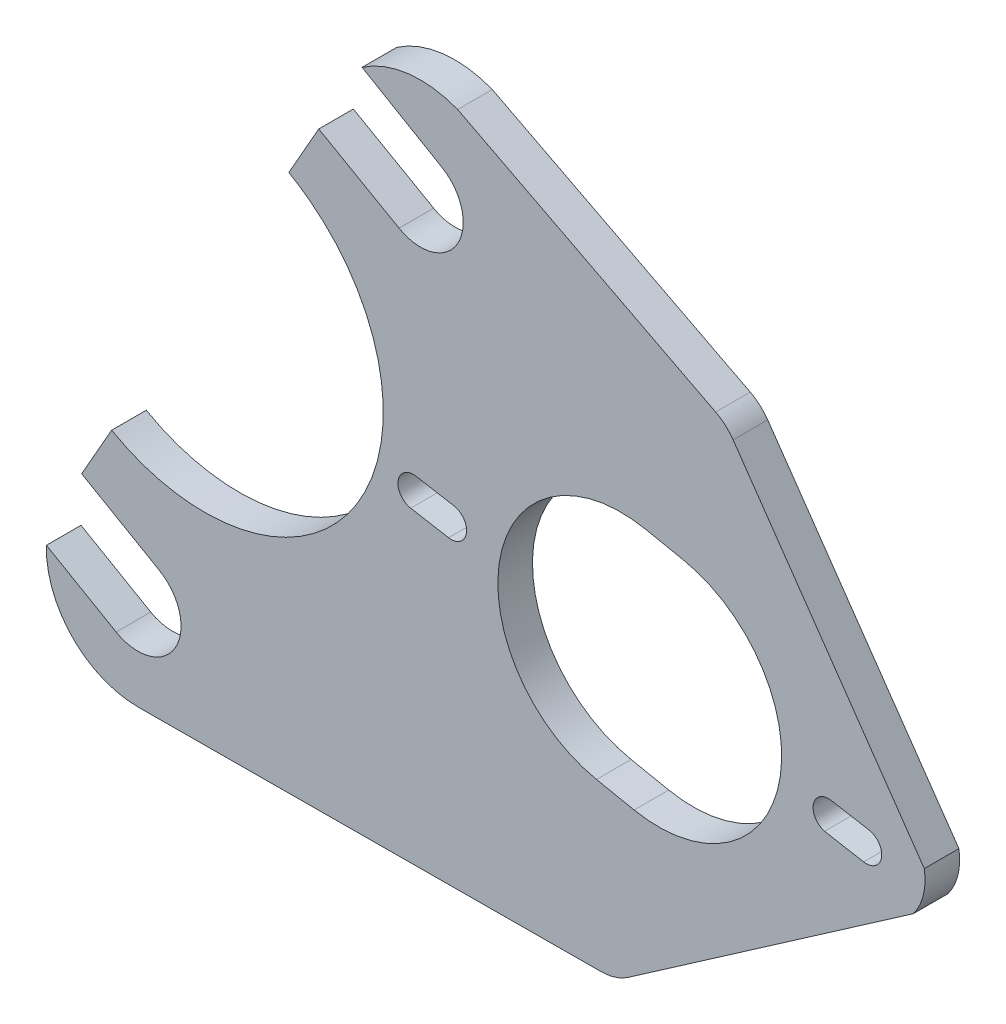
ISO-10303-21;
HEADER;
FILE_DESCRIPTION(('STEP AP214'),'2;1');
FILE_NAME('part.step','',(''),(''),'','','');
FILE_SCHEMA(('AUTOMOTIVE_DESIGN { 1 0 10303 214 1 1 1 1 }'));
ENDSEC;
DATA;
#1=APPLICATION_CONTEXT('core data for automotive mechanical design processes');
#2=APPLICATION_PROTOCOL_DEFINITION('international standard','automotive_design',2000,#1);
#3=PRODUCT_CONTEXT('',#1,'mechanical');
#4=PRODUCT('Part','Part','',(#3));
#5=PRODUCT_RELATED_PRODUCT_CATEGORY('part','',(#4));
#6=PRODUCT_DEFINITION_FORMATION('','',#4);
#7=PRODUCT_DEFINITION_CONTEXT('part definition',#1,'design');
#8=PRODUCT_DEFINITION('design','',#6,#7);
#9=PRODUCT_DEFINITION_SHAPE('','',#8);
#10=(LENGTH_UNIT() NAMED_UNIT(*) SI_UNIT(.MILLI.,.METRE.));
#11=(NAMED_UNIT(*) PLANE_ANGLE_UNIT() SI_UNIT($,.RADIAN.));
#12=(NAMED_UNIT(*) SI_UNIT($,.STERADIAN.) SOLID_ANGLE_UNIT());
#13=UNCERTAINTY_MEASURE_WITH_UNIT(LENGTH_MEASURE(1.E-05),#10,'distance_accuracy_value','');
#14=(GEOMETRIC_REPRESENTATION_CONTEXT(3) GLOBAL_UNCERTAINTY_ASSIGNED_CONTEXT((#13)) GLOBAL_UNIT_ASSIGNED_CONTEXT((#10,
#11,#12)) REPRESENTATION_CONTEXT('',''));
#15=CARTESIAN_POINT('',(0.,0.,0.));
#16=DIRECTION('',(0.,0.,1.));
#17=DIRECTION('',(1.,0.,0.));
#18=AXIS2_PLACEMENT_3D('',#15,#16,#17);
#19=CARTESIAN_POINT('',(66.2260905389,75.3633362444,3.6));
#20=DIRECTION('',(0.,0.,1.));
#21=DIRECTION('',(1.,0.,0.));
#22=AXIS2_PLACEMENT_3D('',#19,#20,#21);
#23=PLANE('',#22);
#24=CARTESIAN_POINT('',(88.3938452046275,69.2605225420493,3.6));
#25=DIRECTION('',(0.,0.,1.));
#26=DIRECTION('',(1.,0.,0.));
#27=AXIS2_PLACEMENT_3D('',#24,#25,#26);
#28=CIRCLE('',#27,1.59999999999999);
#29=CARTESIAN_POINT('',(88.6716822936606,70.8362149460285,3.6));
#30=VERTEX_POINT('',#29);
#31=CARTESIAN_POINT('',(88.1160081155943,67.6848301380701,3.6));
#32=VERTEX_POINT('',#31);
#33=EDGE_CURVE('E451',#30,#32,#28,.T.);
#34=ORIENTED_EDGE('',*,*,#33,.F.);
#35=DIRECTION('',(-0.984807752486968,0.173648180645713,0.));
#36=VECTOR('',#35,1.);
#37=CARTESIAN_POINT('',(14.7874848721338,83.8639926298628,3.6));
#38=LINE('',#37,#36);
#39=CARTESIAN_POINT('',(92.6109133036085,70.1416222234456,3.6));
#40=VERTEX_POINT('',#39);
#41=EDGE_CURVE('E449',#40,#30,#38,.T.);
#42=ORIENTED_EDGE('',*,*,#41,.F.);
#43=CARTESIAN_POINT('',(92.3330762145753,68.5659298194664,3.6));
#44=DIRECTION('',(0.,0.,1.));
#45=DIRECTION('',(1.,0.,0.));
#46=AXIS2_PLACEMENT_3D('',#43,#44,#45);
#47=CIRCLE('',#46,1.6);
#48=CARTESIAN_POINT('',(92.0552391303082,66.9902374146469,3.6));
#49=VERTEX_POINT('',#48);
#50=EDGE_CURVE('E457',#49,#40,#47,.T.);
#51=ORIENTED_EDGE('',*,*,#50,.F.);
#52=DIRECTION('',(-0.984807752486969,0.173648180645707,0.));
#53=VECTOR('',#52,1.);
#54=CARTESIAN_POINT('',(14.231810694067,80.7126078219041,3.6));
#55=LINE('',#54,#53);
#56=EDGE_CURVE('E454',#49,#32,#55,.T.);
#57=ORIENTED_EDGE('',*,*,#56,.T.);
#58=EDGE_LOOP('',(#34,#42,#51,#57));
#59=FACE_BOUND('',#58,.T.);
#60=DIRECTION('',(-0.98457738784415,0.174949613734897,0.));
#61=VECTOR('',#60,1.);
#62=CARTESIAN_POINT('',(14.3668853296237,80.8536248084082,3.6));
#63=LINE('',#62,#61);
#64=CARTESIAN_POINT('',(135.228884267393,59.377649135547,3.6));
#65=VERTEX_POINT('',#64);
#66=CARTESIAN_POINT('',(131.161569827429,60.1003704766984,3.6));
#67=VERTEX_POINT('',#66);
#68=EDGE_CURVE('E480',#65,#67,#63,.T.);
#69=ORIENTED_EDGE('',*,*,#68,.T.);
#70=CARTESIAN_POINT('',(131.569557431556,61.6474794304822,3.6));
#71=DIRECTION('',(0.,0.,1.));
#72=DIRECTION('',(1.,0.,0.));
#73=AXIS2_PLACEMENT_3D('',#70,#71,#72);
#74=CIRCLE('',#73,1.6);
#75=CARTESIAN_POINT('',(131.847360571655,63.2231778201976,3.6));
#76=VERTEX_POINT('',#75);
#77=EDGE_CURVE('E489',#76,#67,#74,.T.);
#78=ORIENTED_EDGE('',*,*,#77,.F.);
#79=DIRECTION('',(-0.98481149357211,0.173626962561322,0.));
#80=VECTOR('',#79,1.);
#81=CARTESIAN_POINT('',(14.7852333251543,83.86178908483,3.6));
#82=LINE('',#81,#80);
#83=CARTESIAN_POINT('',(135.786606545943,62.5286699699523,3.6));
#84=VERTEX_POINT('',#83);
#85=EDGE_CURVE('E486',#84,#76,#82,.T.);
#86=ORIENTED_EDGE('',*,*,#85,.F.);
#87=CARTESIAN_POINT('',(135.508803527145,60.952972268249,3.6));
#88=DIRECTION('',(0.,0.,1.));
#89=DIRECTION('',(1.,0.,0.));
#90=AXIS2_PLACEMENT_3D('',#87,#88,#89);
#91=CIRCLE('',#90,1.59999930137684);
#92=EDGE_CURVE('E483',#65,#84,#91,.T.);
#93=ORIENTED_EDGE('',*,*,#92,.F.);
#94=EDGE_LOOP('',(#69,#78,#86,#93));
#95=FACE_BOUND('',#94,.T.);
#96=CARTESIAN_POINT('',(109.981701342205,65.4540011230173,3.6));
#97=DIRECTION('',(0.,0.,1.));
#98=DIRECTION('',(1.,0.,0.));
#99=AXIS2_PLACEMENT_3D('',#96,#97,#98);
#100=CIRCLE('',#99,12.8);
#101=CARTESIAN_POINT('',(112.523140625589,77.9991629939887,3.6));
#102=VERTEX_POINT('',#101);
#103=CARTESIAN_POINT('',(107.440262058821,52.908839252046,3.6));
#104=VERTEX_POINT('',#103);
#105=EDGE_CURVE('E512',#102,#104,#100,.T.);
#106=ORIENTED_EDGE('',*,*,#105,.F.);
#107=DIRECTION('',(-0.980090771169636,0.198549944014369,0.));
#108=VECTOR('',#107,1.);
#109=CARTESIAN_POINT('',(19.6142968870189,96.8209356964479,3.6));
#110=LINE('',#109,#108);
#111=CARTESIAN_POINT('',(116.443503710267,77.2049632179312,3.6));
#112=VERTEX_POINT('',#111);
#113=EDGE_CURVE('E510',#112,#102,#110,.T.);
#114=ORIENTED_EDGE('',*,*,#113,.F.);
#115=CARTESIAN_POINT('',(113.902064426883,64.6598013469599,3.6));
#116=DIRECTION('',(0.,0.,1.));
#117=DIRECTION('',(1.,0.,0.));
#118=AXIS2_PLACEMENT_3D('',#115,#116,#117);
#119=CIRCLE('',#118,12.8);
#120=CARTESIAN_POINT('',(111.3606251435,52.1146394759885,3.6));
#121=VERTEX_POINT('',#120);
#122=EDGE_CURVE('E518',#121,#112,#119,.T.);
#123=ORIENTED_EDGE('',*,*,#122,.F.);
#124=DIRECTION('',(-0.980090771169636,0.198549944014369,0.));
#125=VECTOR('',#124,1.);
#126=CARTESIAN_POINT('',(14.5314183202511,71.7306119545052,3.6));
#127=LINE('',#126,#125);
#128=EDGE_CURVE('E515',#121,#104,#127,.T.);
#129=ORIENTED_EDGE('',*,*,#128,.T.);
#130=EDGE_LOOP('',(#106,#114,#123,#129));
#131=FACE_BOUND('',#130,.T.);
#132=DIRECTION('',(-0.821795837048083,-0.569782065539484,0.));
#133=VECTOR('',#132,1.);
#134=CARTESIAN_POINT('',(98.7671263425765,28.429448054406,3.6));
#135=LINE('',#134,#133);
#136=CARTESIAN_POINT('',(140.392023866923,57.2895602867628,3.6));
#137=VERTEX_POINT('',#136);
#138=CARTESIAN_POINT('',(110.735316218971,36.7274457335327,3.6));
#139=VERTEX_POINT('',#138);
#140=EDGE_CURVE('E440',#137,#139,#135,.T.);
#141=ORIENTED_EDGE('',*,*,#140,.F.);
#142=CARTESIAN_POINT('',(135.508803527145,60.952972268249,3.6));
#143=DIRECTION('',(0.,0.,1.));
#144=DIRECTION('',(1.,0.,0.));
#145=AXIS2_PLACEMENT_3D('',#142,#143,#144);
#146=CIRCLE('',#145,6.10462351279076);
#147=CARTESIAN_POINT('',(141.535727347608,61.9238571714403,3.6));
#148=VERTEX_POINT('',#147);
#149=EDGE_CURVE('E422',#137,#148,#146,.T.);
#150=ORIENTED_EDGE('',*,*,#149,.T.);
#151=DIRECTION('',(0.569782065539484,-0.821795837048083,0.));
#152=VECTOR('',#151,1.);
#153=CARTESIAN_POINT('',(124.581434059325,86.3770095029575,3.6));
#154=LINE('',#153,#152);
#155=CARTESIAN_POINT('',(121.651882961464,90.6022967526749,3.6));
#156=VERTEX_POINT('',#155);
#157=EDGE_CURVE('E426',#156,#148,#154,.T.);
#158=ORIENTED_EDGE('',*,*,#157,.F.);
#159=CARTESIAN_POINT('',(117.542903776224,87.7533864249775,3.6));
#160=DIRECTION('',(0.,0.,1.));
#161=DIRECTION('',(1.,0.,0.));
#162=AXIS2_PLACEMENT_3D('',#159,#160,#161);
#163=CIRCLE('',#162,5.);
#164=CARTESIAN_POINT('',(119.834613545866,92.1972660736322,3.6));
#165=VERTEX_POINT('',#164);
#166=EDGE_CURVE('E711',#156,#165,#163,.T.);
#167=ORIENTED_EDGE('',*,*,#166,.T.);
#168=DIRECTION('',(-0.888775929730931,0.458341953928417,0.));
#169=VECTOR('',#168,1.);
#170=CARTESIAN_POINT('',(62.7323198720739,121.64493221842,3.6));
#171=LINE('',#170,#169);
#172=CARTESIAN_POINT('',(92.9994998125568,106.0361404749,3.6));
#173=VERTEX_POINT('',#172);
#174=EDGE_CURVE('E447',#165,#173,#171,.T.);
#175=ORIENTED_EDGE('',*,*,#174,.T.);
#176=CARTESIAN_POINT('',(89.1295998537948,96.1540237001324,3.6));
#177=DIRECTION('',(0.,0.,1.));
#178=DIRECTION('',(1.,0.,0.));
#179=AXIS2_PLACEMENT_3D('',#176,#177,#178);
#180=CIRCLE('',#179,10.6128392827256);
#181=CARTESIAN_POINT('',(83.0608323656568,104.8604821544,3.6));
#182=VERTEX_POINT('',#181);
#183=EDGE_CURVE('E696',#173,#182,#180,.T.);
#184=ORIENTED_EDGE('',*,*,#183,.T.);
#185=DIRECTION('',(0.863225442370652,-0.504818616578263,0.));
#186=VECTOR('',#185,1.);
#187=CARTESIAN_POINT('',(83.0608323656568,104.8604821544,3.6));
#188=LINE('',#187,#186);
#189=CARTESIAN_POINT('',(91.3561306915568,100.0093496235,3.6));
#190=VERTEX_POINT('',#189);
#191=EDGE_CURVE('E723',#182,#190,#188,.T.);
#192=ORIENTED_EDGE('',*,*,#191,.T.);
#193=CARTESIAN_POINT('',(89.1300439095068,96.1537673169998,3.6));
#194=DIRECTION('',(0.,0.,1.));
#195=DIRECTION('',(1.,0.,0.));
#196=AXIS2_PLACEMENT_3D('',#193,#194,#195);
#197=CIRCLE('',#196,4.45207561519496);
#198=CARTESIAN_POINT('',(86.9039571274568,92.2981850104998,3.6));
#199=VERTEX_POINT('',#198);
#200=EDGE_CURVE('E725',#199,#190,#197,.T.);
#201=ORIENTED_EDGE('',*,*,#200,.F.);
#202=DIRECTION('',(0.868810396856309,-0.495144922537214,0.));
#203=VECTOR('',#202,1.);
#204=CARTESIAN_POINT('',(78.5551802845568,97.0562478491998,3.6));
#205=LINE('',#204,#203);
#206=CARTESIAN_POINT('',(78.5551802845568,97.0562478491998,3.6));
#207=VERTEX_POINT('',#206);
#208=EDGE_CURVE('E748',#207,#199,#205,.T.);
#209=ORIENTED_EDGE('',*,*,#208,.F.);
#210=DIRECTION('',(0.494117617130238,0.869395065802386,0.));
#211=VECTOR('',#210,1.);
#212=CARTESIAN_POINT('',(75.4400477996607,91.5752030173668,3.6));
#213=LINE('',#212,#211);
#214=CARTESIAN_POINT('',(75.4400477996607,91.5752030173668,3.6));
#215=VERTEX_POINT('',#214);
#216=EDGE_CURVE('E564',#215,#207,#213,.T.);
#217=ORIENTED_EDGE('',*,*,#216,.F.);
#218=CARTESIAN_POINT('',(66.2260905389,75.3633362444,3.6));
#219=DIRECTION('',(0.,0.,1.));
#220=DIRECTION('',(0.869395065803295,-0.494117617128639,0.));
#221=AXIS2_PLACEMENT_3D('',#218,#219,#220);
#222=ELLIPSE('',#221,19.1691381710503,18.6472955858899);
#223=CARTESIAN_POINT('',(57.0121332781069,59.1514694714516,3.6));
#224=VERTEX_POINT('',#223);
#225=EDGE_CURVE('E560',#224,#215,#222,.T.);
#226=ORIENTED_EDGE('',*,*,#225,.F.);
#227=DIRECTION('',(0.494117617130272,0.869395065802367,0.));
#228=VECTOR('',#227,1.);
#229=CARTESIAN_POINT('',(53.8970007932,53.6704246396,3.6));
#230=LINE('',#229,#228);
#231=CARTESIAN_POINT('',(53.8970007932,53.6704246396,3.6));
#232=VERTEX_POINT('',#231);
#233=EDGE_CURVE('E557',#232,#224,#230,.T.);
#234=ORIENTED_EDGE('',*,*,#233,.F.);
#235=DIRECTION('',(-0.865993027095381,0.500056073877899,0.));
#236=VECTOR('',#235,1.);
#237=CARTESIAN_POINT('',(61.9848103957,49.0002273175,3.6));
#238=LINE('',#237,#236);
#239=CARTESIAN_POINT('',(61.9848103957,49.0002273175,3.6));
#240=VERTEX_POINT('',#239);
#241=EDGE_CURVE('E554',#240,#232,#238,.T.);
#242=ORIENTED_EDGE('',*,*,#241,.F.);
#243=CARTESIAN_POINT('',(59.73290559445,45.10432597855,3.6));
#244=DIRECTION('',(0.,0.,1.));
#245=DIRECTION('',(1.,0.,0.));
#246=AXIS2_PLACEMENT_3D('',#243,#244,#245);
#247=CIRCLE('',#246,4.49990249635758);
#248=CARTESIAN_POINT('',(57.4810007932,41.2084246396,3.6));
#249=VERTEX_POINT('',#248);
#250=EDGE_CURVE('E551',#249,#240,#247,.T.);
#251=ORIENTED_EDGE('',*,*,#250,.F.);
#252=DIRECTION('',(0.866028909405279,-0.499993928037435,0.));
#253=VECTOR('',#252,1.);
#254=CARTESIAN_POINT('',(50.2285358717,45.3955694158,3.6));
#255=LINE('',#254,#253);
#256=CARTESIAN_POINT('',(50.2285358717,45.3955694158,3.6));
#257=VERTEX_POINT('',#256);
#258=EDGE_CURVE('E548',#257,#249,#255,.T.);
#259=ORIENTED_EDGE('',*,*,#258,.F.);
#260=CARTESIAN_POINT('',(59.7347823866165,45.103647176955,3.6));
#261=DIRECTION('',(0.,0.,1.));
#262=DIRECTION('',(1.,0.,0.));
#263=AXIS2_PLACEMENT_3D('',#260,#261,#262);
#264=CIRCLE('',#263,9.51072770064907);
#265=CARTESIAN_POINT('',(59.7828894487,35.5930411444,3.6));
#266=VERTEX_POINT('',#265);
#267=EDGE_CURVE('E544',#257,#266,#264,.T.);
#268=ORIENTED_EDGE('',*,*,#267,.T.);
#269=DIRECTION('',(0.999987207278143,0.00505818940525294,0.));
#270=VECTOR('',#269,1.);
#271=CARTESIAN_POINT('',(107.879099237603,35.8363239954365,3.6));
#272=LINE('',#271,#270);
#273=CARTESIAN_POINT('',(107.9116968383,35.8364888823843,3.6));
#274=VERTEX_POINT('',#273);
#275=EDGE_CURVE('E541',#266,#274,#272,.T.);
#276=ORIENTED_EDGE('',*,*,#275,.T.);
#277=CARTESIAN_POINT('',(107.886405891274,40.8364249187731,3.6));
#278=DIRECTION('',(0.,0.,1.));
#279=DIRECTION('',(1.,0.,0.));
#280=AXIS2_PLACEMENT_3D('',#277,#278,#279);
#281=CIRCLE('',#280,5.);
#282=EDGE_CURVE('E761',#274,#139,#281,.T.);
#283=ORIENTED_EDGE('',*,*,#282,.T.);
#284=EDGE_LOOP('',(#141,#150,#158,#167,#175,#184,#192,#201,#209,#217,#226,#234,#242,#251,#259,
#268,#276,#283));
#285=FACE_BOUND('',#284,.T.);
#286=ADVANCED_FACE('F224',(#59,#95,#131,#285),#23,.T.);
#287=CARTESIAN_POINT('',(66.2260905389,75.3633362444,0.));
#288=DIRECTION('',(0.,0.,1.));
#289=DIRECTION('',(1.,0.,0.));
#290=AXIS2_PLACEMENT_3D('',#287,#288,#289);
#291=PLANE('',#290);
#292=DIRECTION('',(-0.984807752486968,0.173648180645713,0.));
#293=VECTOR('',#292,1.);
#294=CARTESIAN_POINT('',(14.7874848721338,83.8639926298628,0.));
#295=LINE('',#294,#293);
#296=CARTESIAN_POINT('',(92.6109133036085,70.1416222234456,0.));
#297=VERTEX_POINT('',#296);
#298=CARTESIAN_POINT('',(88.6716822936606,70.8362149460285,0.));
#299=VERTEX_POINT('',#298);
#300=EDGE_CURVE('E443',#297,#299,#295,.T.);
#301=ORIENTED_EDGE('',*,*,#300,.T.);
#302=CARTESIAN_POINT('',(88.3938452046275,69.2605225420493,0.));
#303=DIRECTION('',(0.,0.,1.));
#304=DIRECTION('',(1.,0.,0.));
#305=AXIS2_PLACEMENT_3D('',#302,#303,#304);
#306=CIRCLE('',#305,1.59999999999999);
#307=CARTESIAN_POINT('',(88.1160081155943,67.6848301380701,0.));
#308=VERTEX_POINT('',#307);
#309=EDGE_CURVE('E462',#299,#308,#306,.T.);
#310=ORIENTED_EDGE('',*,*,#309,.T.);
#311=DIRECTION('',(-0.984807752486969,0.173648180645707,0.));
#312=VECTOR('',#311,1.);
#313=CARTESIAN_POINT('',(14.231810694067,80.7126078219041,0.));
#314=LINE('',#313,#312);
#315=CARTESIAN_POINT('',(92.0552391303082,66.9902374146469,0.));
#316=VERTEX_POINT('',#315);
#317=EDGE_CURVE('E465',#316,#308,#314,.T.);
#318=ORIENTED_EDGE('',*,*,#317,.F.);
#319=CARTESIAN_POINT('',(92.3330762145753,68.5659298194664,0.));
#320=DIRECTION('',(0.,0.,1.));
#321=DIRECTION('',(1.,0.,0.));
#322=AXIS2_PLACEMENT_3D('',#319,#320,#321);
#323=CIRCLE('',#322,1.6);
#324=EDGE_CURVE('E452',#316,#297,#323,.T.);
#325=ORIENTED_EDGE('',*,*,#324,.T.);
#326=EDGE_LOOP('',(#301,#310,#318,#325));
#327=FACE_BOUND('',#326,.T.);
#328=CARTESIAN_POINT('',(131.569557431556,61.6474794304822,0.));
#329=DIRECTION('',(0.,0.,1.));
#330=DIRECTION('',(1.,0.,0.));
#331=AXIS2_PLACEMENT_3D('',#328,#329,#330);
#332=CIRCLE('',#331,1.6);
#333=CARTESIAN_POINT('',(131.847360571655,63.2231778201976,0.));
#334=VERTEX_POINT('',#333);
#335=CARTESIAN_POINT('',(131.161569827429,60.1003704766984,0.));
#336=VERTEX_POINT('',#335);
#337=EDGE_CURVE('E484',#334,#336,#332,.T.);
#338=ORIENTED_EDGE('',*,*,#337,.T.);
#339=DIRECTION('',(-0.98457738784415,0.174949613734897,0.));
#340=VECTOR('',#339,1.);
#341=CARTESIAN_POINT('',(14.3668853296237,80.8536248084082,0.));
#342=LINE('',#341,#340);
#343=CARTESIAN_POINT('',(135.228884267393,59.377649135547,0.));
#344=VERTEX_POINT('',#343);
#345=EDGE_CURVE('E479',#344,#336,#342,.T.);
#346=ORIENTED_EDGE('',*,*,#345,.F.);
#347=CARTESIAN_POINT('',(135.508803527145,60.952972268249,0.));
#348=DIRECTION('',(0.,0.,1.));
#349=DIRECTION('',(1.,0.,0.));
#350=AXIS2_PLACEMENT_3D('',#347,#348,#349);
#351=CIRCLE('',#350,1.59999930137684);
#352=CARTESIAN_POINT('',(135.786606545943,62.5286699699523,0.));
#353=VERTEX_POINT('',#352);
#354=EDGE_CURVE('E493',#344,#353,#351,.T.);
#355=ORIENTED_EDGE('',*,*,#354,.T.);
#356=DIRECTION('',(-0.98481149357211,0.173626962561322,0.));
#357=VECTOR('',#356,1.);
#358=CARTESIAN_POINT('',(14.7852333251543,83.86178908483,0.));
#359=LINE('',#358,#357);
#360=EDGE_CURVE('E496',#353,#334,#359,.T.);
#361=ORIENTED_EDGE('',*,*,#360,.T.);
#362=EDGE_LOOP('',(#338,#346,#355,#361));
#363=FACE_BOUND('',#362,.T.);
#364=DIRECTION('',(-0.980090771169636,0.198549944014369,0.));
#365=VECTOR('',#364,1.);
#366=CARTESIAN_POINT('',(19.6142968870189,96.8209356964479,0.));
#367=LINE('',#366,#365);
#368=CARTESIAN_POINT('',(116.443503710267,77.2049632179312,0.));
#369=VERTEX_POINT('',#368);
#370=CARTESIAN_POINT('',(112.523140625589,77.9991629939887,0.));
#371=VERTEX_POINT('',#370);
#372=EDGE_CURVE('E509',#369,#371,#367,.T.);
#373=ORIENTED_EDGE('',*,*,#372,.T.);
#374=CARTESIAN_POINT('',(109.981701342205,65.4540011230173,0.));
#375=DIRECTION('',(0.,0.,1.));
#376=DIRECTION('',(1.,0.,0.));
#377=AXIS2_PLACEMENT_3D('',#374,#375,#376);
#378=CIRCLE('',#377,12.8);
#379=CARTESIAN_POINT('',(107.440262058821,52.908839252046,0.));
#380=VERTEX_POINT('',#379);
#381=EDGE_CURVE('E523',#371,#380,#378,.T.);
#382=ORIENTED_EDGE('',*,*,#381,.T.);
#383=DIRECTION('',(-0.980090771169636,0.198549944014369,0.));
#384=VECTOR('',#383,1.);
#385=CARTESIAN_POINT('',(14.5314183202511,71.7306119545052,0.));
#386=LINE('',#385,#384);
#387=CARTESIAN_POINT('',(111.3606251435,52.1146394759885,0.));
#388=VERTEX_POINT('',#387);
#389=EDGE_CURVE('E526',#388,#380,#386,.T.);
#390=ORIENTED_EDGE('',*,*,#389,.F.);
#391=CARTESIAN_POINT('',(113.902064426883,64.6598013469599,0.));
#392=DIRECTION('',(0.,0.,1.));
#393=DIRECTION('',(1.,0.,0.));
#394=AXIS2_PLACEMENT_3D('',#391,#392,#393);
#395=CIRCLE('',#394,12.8);
#396=EDGE_CURVE('E513',#388,#369,#395,.T.);
#397=ORIENTED_EDGE('',*,*,#396,.T.);
#398=EDGE_LOOP('',(#373,#382,#390,#397));
#399=FACE_BOUND('',#398,.T.);
#400=CARTESIAN_POINT('',(135.508803527145,60.952972268249,0.));
#401=DIRECTION('',(0.,0.,-1.));
#402=DIRECTION('',(-1.,0.,0.));
#403=AXIS2_PLACEMENT_3D('',#400,#401,#402);
#404=CIRCLE('',#403,6.10462351279076);
#405=CARTESIAN_POINT('',(141.535727347608,61.9238571714403,0.));
#406=VERTEX_POINT('',#405);
#407=CARTESIAN_POINT('',(140.392023866923,57.2895602867629,0.));
#408=VERTEX_POINT('',#407);
#409=EDGE_CURVE('E238',#406,#408,#404,.T.);
#410=ORIENTED_EDGE('',*,*,#409,.T.);
#411=DIRECTION('',(0.821795837048083,0.569782065539484,0.));
#412=VECTOR('',#411,1.);
#413=CARTESIAN_POINT('',(140.869018833265,57.6202788970579,0.));
#414=LINE('',#413,#412);
#415=CARTESIAN_POINT('',(110.735316218971,36.7274457335327,0.));
#416=VERTEX_POINT('',#415);
#417=EDGE_CURVE('E432',#416,#408,#414,.T.);
#418=ORIENTED_EDGE('',*,*,#417,.F.);
#419=CARTESIAN_POINT('',(107.886405891274,40.8364249187731,0.));
#420=DIRECTION('',(0.,0.,1.));
#421=DIRECTION('',(1.,0.,0.));
#422=AXIS2_PLACEMENT_3D('',#419,#420,#421);
#423=CIRCLE('',#422,5.);
#424=CARTESIAN_POINT('',(107.9116968383,35.8364888823824,0.));
#425=VERTEX_POINT('',#424);
#426=EDGE_CURVE('E705',#416,#425,#423,.F.);
#427=ORIENTED_EDGE('',*,*,#426,.T.);
#428=DIRECTION('',(0.999987207278144,0.00505818940520393,0.));
#429=VECTOR('',#428,1.);
#430=CARTESIAN_POINT('',(59.7828894487,35.5930411444,0.));
#431=LINE('',#430,#429);
#432=CARTESIAN_POINT('',(59.7828894487,35.5930411444,0.));
#433=VERTEX_POINT('',#432);
#434=EDGE_CURVE('E540',#433,#425,#431,.T.);
#435=ORIENTED_EDGE('',*,*,#434,.F.);
#436=CARTESIAN_POINT('',(59.7347823866165,45.103647176955,0.));
#437=DIRECTION('',(0.,0.,1.));
#438=DIRECTION('',(1.,0.,0.));
#439=AXIS2_PLACEMENT_3D('',#436,#437,#438);
#440=CIRCLE('',#439,9.51072770064907);
#441=CARTESIAN_POINT('',(50.2285358717,45.3955694158,0.));
#442=VERTEX_POINT('',#441);
#443=EDGE_CURVE('E731',#442,#433,#440,.T.);
#444=ORIENTED_EDGE('',*,*,#443,.F.);
#445=DIRECTION('',(0.866028909405279,-0.499993928037435,0.));
#446=VECTOR('',#445,1.);
#447=CARTESIAN_POINT('',(50.2285358717,45.3955694158,0.));
#448=LINE('',#447,#446);
#449=CARTESIAN_POINT('',(57.4810007932,41.2084246396,0.));
#450=VERTEX_POINT('',#449);
#451=EDGE_CURVE('E733',#442,#450,#448,.T.);
#452=ORIENTED_EDGE('',*,*,#451,.T.);
#453=CARTESIAN_POINT('',(59.73290559445,45.10432597855,0.));
#454=DIRECTION('',(0.,0.,1.));
#455=DIRECTION('',(1.,0.,0.));
#456=AXIS2_PLACEMENT_3D('',#453,#454,#455);
#457=CIRCLE('',#456,4.49990249635758);
#458=CARTESIAN_POINT('',(61.9848103957,49.0002273175,0.));
#459=VERTEX_POINT('',#458);
#460=EDGE_CURVE('E736',#450,#459,#457,.T.);
#461=ORIENTED_EDGE('',*,*,#460,.T.);
#462=DIRECTION('',(-0.865993027095381,0.500056073877899,0.));
#463=VECTOR('',#462,1.);
#464=CARTESIAN_POINT('',(61.9848103957,49.0002273175,0.));
#465=LINE('',#464,#463);
#466=CARTESIAN_POINT('',(53.8970007932,53.6704246396,0.));
#467=VERTEX_POINT('',#466);
#468=EDGE_CURVE('E739',#459,#467,#465,.T.);
#469=ORIENTED_EDGE('',*,*,#468,.T.);
#470=DIRECTION('',(0.494117617130272,0.869395065802367,0.));
#471=VECTOR('',#470,1.);
#472=CARTESIAN_POINT('',(53.8970007932,53.6704246396,0.));
#473=LINE('',#472,#471);
#474=CARTESIAN_POINT('',(57.0121332781069,59.1514694714516,0.));
#475=VERTEX_POINT('',#474);
#476=EDGE_CURVE('E661',#467,#475,#473,.T.);
#477=ORIENTED_EDGE('',*,*,#476,.T.);
#478=CARTESIAN_POINT('',(66.2260905389,75.3633362444,0.));
#479=DIRECTION('',(0.,0.,1.));
#480=DIRECTION('',(0.869395065803295,-0.494117617128639,0.));
#481=AXIS2_PLACEMENT_3D('',#478,#479,#480);
#482=ELLIPSE('',#481,19.1691381710503,18.6472955858899);
#483=CARTESIAN_POINT('',(75.4400477996607,91.5752030173668,0.));
#484=VERTEX_POINT('',#483);
#485=EDGE_CURVE('E659',#475,#484,#482,.T.);
#486=ORIENTED_EDGE('',*,*,#485,.T.);
#487=DIRECTION('',(0.494117617130238,0.869395065802386,0.));
#488=VECTOR('',#487,1.);
#489=CARTESIAN_POINT('',(75.4400477996607,91.5752030173668,0.));
#490=LINE('',#489,#488);
#491=CARTESIAN_POINT('',(78.5551802845568,97.0562478491998,0.));
#492=VERTEX_POINT('',#491);
#493=EDGE_CURVE('E653',#484,#492,#490,.T.);
#494=ORIENTED_EDGE('',*,*,#493,.T.);
#495=DIRECTION('',(0.868810396856309,-0.495144922537214,0.));
#496=VECTOR('',#495,1.);
#497=CARTESIAN_POINT('',(78.5551802845568,97.0562478491998,0.));
#498=LINE('',#497,#496);
#499=CARTESIAN_POINT('',(86.9039571274568,92.2981850104998,0.));
#500=VERTEX_POINT('',#499);
#501=EDGE_CURVE('E644',#492,#500,#498,.T.);
#502=ORIENTED_EDGE('',*,*,#501,.T.);
#503=CARTESIAN_POINT('',(89.1300439095068,96.1537673169998,0.));
#504=DIRECTION('',(0.,0.,1.));
#505=DIRECTION('',(1.,0.,0.));
#506=AXIS2_PLACEMENT_3D('',#503,#504,#505);
#507=CIRCLE('',#506,4.45207561519496);
#508=CARTESIAN_POINT('',(91.3561306915568,100.0093496235,0.));
#509=VERTEX_POINT('',#508);
#510=EDGE_CURVE('E652',#500,#509,#507,.T.);
#511=ORIENTED_EDGE('',*,*,#510,.T.);
#512=DIRECTION('',(0.863225442370652,-0.504818616578263,0.));
#513=VECTOR('',#512,1.);
#514=CARTESIAN_POINT('',(83.0608323656568,104.8604821544,0.));
#515=LINE('',#514,#513);
#516=CARTESIAN_POINT('',(83.0608323656568,104.8604821544,0.));
#517=VERTEX_POINT('',#516);
#518=EDGE_CURVE('E666',#517,#509,#515,.T.);
#519=ORIENTED_EDGE('',*,*,#518,.F.);
#520=CARTESIAN_POINT('',(89.1295998537948,96.1540237001324,0.));
#521=DIRECTION('',(0.,0.,1.));
#522=DIRECTION('',(1.,0.,0.));
#523=AXIS2_PLACEMENT_3D('',#520,#521,#522);
#524=CIRCLE('',#523,10.6128392827256);
#525=CARTESIAN_POINT('',(92.9994998125568,106.0361404749,0.));
#526=VERTEX_POINT('',#525);
#527=EDGE_CURVE('E545',#526,#517,#524,.T.);
#528=ORIENTED_EDGE('',*,*,#527,.F.);
#529=DIRECTION('',(-0.888775929730931,0.458341953928417,0.));
#530=VECTOR('',#529,1.);
#531=CARTESIAN_POINT('',(62.7323198720739,121.64493221842,0.));
#532=LINE('',#531,#530);
#533=CARTESIAN_POINT('',(119.834613545866,92.1972660736322,0.));
#534=VERTEX_POINT('',#533);
#535=EDGE_CURVE('E441',#534,#526,#532,.T.);
#536=ORIENTED_EDGE('',*,*,#535,.F.);
#537=CARTESIAN_POINT('',(117.542903776224,87.7533864249775,0.));
#538=DIRECTION('',(0.,0.,1.));
#539=DIRECTION('',(1.,0.,0.));
#540=AXIS2_PLACEMENT_3D('',#537,#538,#539);
#541=CIRCLE('',#540,5.);
#542=CARTESIAN_POINT('',(121.651882961464,90.6022967526749,0.));
#543=VERTEX_POINT('',#542);
#544=EDGE_CURVE('E232',#534,#543,#541,.F.);
#545=ORIENTED_EDGE('',*,*,#544,.T.);
#546=DIRECTION('',(0.569782065539484,-0.821795837048083,0.));
#547=VECTOR('',#546,1.);
#548=CARTESIAN_POINT('',(124.581434059325,86.3770095029575,0.));
#549=LINE('',#548,#547);
#550=EDGE_CURVE('E435',#543,#406,#549,.T.);
#551=ORIENTED_EDGE('',*,*,#550,.T.);
#552=EDGE_LOOP('',(#410,#418,#427,#435,#444,#452,#461,#469,#477,#486,#494,#502,#511,#519,#528,
#536,#545,#551));
#553=FACE_BOUND('',#552,.T.);
#554=ADVANCED_FACE('F431',(#327,#363,#399,#553),#291,.F.);
#555=CARTESIAN_POINT('',(140.869018833265,57.6202788970579,10.));
#556=DIRECTION('',(-0.569782065539484,0.821795837048083,0.));
#557=DIRECTION('',(-0.821795837048083,-0.569782065539484,0.));
#558=AXIS2_PLACEMENT_3D('',#555,#556,#557);
#559=PLANE('',#558);
#560=DIRECTION('',(0.,0.,-1.));
#561=VECTOR('',#560,1.);
#562=CARTESIAN_POINT('',(140.392023866923,57.2895602867629,10.));
#563=LINE('',#562,#561);
#564=EDGE_CURVE('E419',#137,#408,#563,.T.);
#565=ORIENTED_EDGE('',*,*,#564,.F.);
#566=ORIENTED_EDGE('',*,*,#140,.T.);
#567=DIRECTION('',(0.,0.,1.));
#568=VECTOR('',#567,1.);
#569=CARTESIAN_POINT('',(110.735316218971,36.7274457335327,10.));
#570=LINE('',#569,#568);
#571=EDGE_CURVE('E439',#139,#416,#570,.F.);
#572=ORIENTED_EDGE('',*,*,#571,.T.);
#573=ORIENTED_EDGE('',*,*,#417,.T.);
#574=EDGE_LOOP('',(#565,#566,#572,#573));
#575=FACE_BOUND('',#574,.T.);
#576=ADVANCED_FACE('F437',(#575),#559,.F.);
#577=CARTESIAN_POINT('',(124.581434059325,86.3770095029575,0.));
#578=DIRECTION('',(-0.821795837048083,-0.569782065539484,0.));
#579=DIRECTION('',(0.569782065539484,-0.821795837048083,0.));
#580=AXIS2_PLACEMENT_3D('',#577,#578,#579);
#581=PLANE('',#580);
#582=DIRECTION('',(0.,0.,-1.));
#583=VECTOR('',#582,1.);
#584=CARTESIAN_POINT('',(141.535727347608,61.9238571714403,10.));
#585=LINE('',#584,#583);
#586=EDGE_CURVE('E12',#406,#148,#585,.F.);
#587=ORIENTED_EDGE('',*,*,#586,.F.);
#588=ORIENTED_EDGE('',*,*,#550,.F.);
#589=DIRECTION('',(0.,0.,1.));
#590=VECTOR('',#589,1.);
#591=CARTESIAN_POINT('',(121.651882961464,90.6022967526749,3.6));
#592=LINE('',#591,#590);
#593=EDGE_CURVE('E708',#543,#156,#592,.T.);
#594=ORIENTED_EDGE('',*,*,#593,.T.);
#595=ORIENTED_EDGE('',*,*,#157,.T.);
#596=EDGE_LOOP('',(#587,#588,#594,#595));
#597=FACE_BOUND('',#596,.T.);
#598=ADVANCED_FACE('F627',(#597),#581,.F.);
#599=CARTESIAN_POINT('',(89.1295998537948,96.1540237001324,3.6));
#600=DIRECTION('',(0.,0.,-1.));
#601=DIRECTION('',(-1.,0.,0.));
#602=AXIS2_PLACEMENT_3D('',#599,#600,#601);
#603=CYLINDRICAL_SURFACE('',#602,10.6128392827256);
#604=ORIENTED_EDGE('',*,*,#527,.T.);
#605=DIRECTION('',(0.,0.,-1.));
#606=VECTOR('',#605,1.);
#607=CARTESIAN_POINT('',(83.0608323656568,104.8604821544,3.6));
#608=LINE('',#607,#606);
#609=EDGE_CURVE('E674',#182,#517,#608,.T.);
#610=ORIENTED_EDGE('',*,*,#609,.F.);
#611=ORIENTED_EDGE('',*,*,#183,.F.);
#612=DIRECTION('',(0.,0.,-1.));
#613=VECTOR('',#612,1.);
#614=CARTESIAN_POINT('',(92.9994998125568,106.0361404749,3.6));
#615=LINE('',#614,#613);
#616=EDGE_CURVE('E670',#173,#526,#615,.T.);
#617=ORIENTED_EDGE('',*,*,#616,.T.);
#618=EDGE_LOOP('',(#604,#610,#611,#617));
#619=FACE_BOUND('',#618,.T.);
#620=ADVANCED_FACE('F623',(#619),#603,.T.);
#621=CARTESIAN_POINT('',(83.0608323656568,104.8604821544,3.6));
#622=DIRECTION('',(0.504818616578263,0.863225442370652,0.));
#623=DIRECTION('',(-0.863225442370652,0.504818616578263,0.));
#624=AXIS2_PLACEMENT_3D('',#621,#622,#623);
#625=PLANE('',#624);
#626=ORIENTED_EDGE('',*,*,#518,.T.);
#627=DIRECTION('',(0.,0.,-1.));
#628=VECTOR('',#627,1.);
#629=CARTESIAN_POINT('',(91.3561306915568,100.0093496235,3.6));
#630=LINE('',#629,#628);
#631=EDGE_CURVE('E677',#190,#509,#630,.T.);
#632=ORIENTED_EDGE('',*,*,#631,.F.);
#633=ORIENTED_EDGE('',*,*,#191,.F.);
#634=ORIENTED_EDGE('',*,*,#609,.T.);
#635=EDGE_LOOP('',(#626,#632,#633,#634));
#636=FACE_BOUND('',#635,.T.);
#637=ADVANCED_FACE('F626',(#636),#625,.F.);
#638=CARTESIAN_POINT('',(89.1300439095068,96.1537673169998,3.6));
#639=DIRECTION('',(0.,0.,-1.));
#640=DIRECTION('',(-1.,0.,0.));
#641=AXIS2_PLACEMENT_3D('',#638,#639,#640);
#642=CYLINDRICAL_SURFACE('',#641,4.45207561519496);
#643=ORIENTED_EDGE('',*,*,#510,.F.);
#644=DIRECTION('',(0.,0.,-1.));
#645=VECTOR('',#644,1.);
#646=CARTESIAN_POINT('',(86.9039571274568,92.2981850104998,3.6));
#647=LINE('',#646,#645);
#648=EDGE_CURVE('E649',#199,#500,#647,.T.);
#649=ORIENTED_EDGE('',*,*,#648,.F.);
#650=ORIENTED_EDGE('',*,*,#200,.T.);
#651=ORIENTED_EDGE('',*,*,#631,.T.);
#652=EDGE_LOOP('',(#643,#649,#650,#651));
#653=FACE_BOUND('',#652,.T.);
#654=ADVANCED_FACE('F631',(#653),#642,.F.);
#655=CARTESIAN_POINT('',(78.5551802845568,97.0562478491998,3.6));
#656=DIRECTION('',(0.495144922537214,0.868810396856309,0.));
#657=DIRECTION('',(-0.868810396856309,0.495144922537214,0.));
#658=AXIS2_PLACEMENT_3D('',#655,#656,#657);
#659=PLANE('',#658);
#660=ORIENTED_EDGE('',*,*,#501,.F.);
#661=DIRECTION('',(0.,0.,-1.));
#662=VECTOR('',#661,1.);
#663=CARTESIAN_POINT('',(78.5551802845568,97.0562478491998,3.6));
#664=LINE('',#663,#662);
#665=EDGE_CURVE('E647',#207,#492,#664,.T.);
#666=ORIENTED_EDGE('',*,*,#665,.F.);
#667=ORIENTED_EDGE('',*,*,#208,.T.);
#668=ORIENTED_EDGE('',*,*,#648,.T.);
#669=EDGE_LOOP('',(#660,#666,#667,#668));
#670=FACE_BOUND('',#669,.T.);
#671=ADVANCED_FACE('F634',(#670),#659,.T.);
#672=CARTESIAN_POINT('',(75.4400477996607,91.5752030173668,3.6));
#673=DIRECTION('',(-0.869395065802386,0.494117617130238,0.));
#674=DIRECTION('',(-0.494117617130238,-0.869395065802386,0.));
#675=AXIS2_PLACEMENT_3D('',#672,#673,#674);
#676=PLANE('',#675);
#677=ORIENTED_EDGE('',*,*,#493,.F.);
#678=DIRECTION('',(0.,0.,-1.));
#679=VECTOR('',#678,1.);
#680=CARTESIAN_POINT('',(75.4400477996607,91.5752030173668,3.6));
#681=LINE('',#680,#679);
#682=EDGE_CURVE('E681',#215,#484,#681,.T.);
#683=ORIENTED_EDGE('',*,*,#682,.F.);
#684=ORIENTED_EDGE('',*,*,#216,.T.);
#685=ORIENTED_EDGE('',*,*,#665,.T.);
#686=EDGE_LOOP('',(#677,#683,#684,#685));
#687=FACE_BOUND('',#686,.T.);
#688=ADVANCED_FACE('F572',(#687),#676,.T.);
#689=DIRECTION('',(0.,0.,-1.));
#690=VECTOR('',#689,1.);
#691=SURFACE_OF_LINEAR_EXTRUSION('',#222,#690);
#692=ORIENTED_EDGE('',*,*,#485,.F.);
#693=DIRECTION('',(0.,0.,-1.));
#694=VECTOR('',#693,1.);
#695=CARTESIAN_POINT('',(57.0121332781069,59.1514694714516,3.6));
#696=LINE('',#695,#694);
#697=EDGE_CURVE('E683',#224,#475,#696,.T.);
#698=ORIENTED_EDGE('',*,*,#697,.F.);
#699=ORIENTED_EDGE('',*,*,#225,.T.);
#700=ORIENTED_EDGE('',*,*,#682,.T.);
#701=EDGE_LOOP('',(#692,#698,#699,#700));
#702=FACE_BOUND('',#701,.T.);
#703=ADVANCED_FACE('F567',(#702),#691,.T.);
#704=CARTESIAN_POINT('',(53.8970007932,53.6704246396,3.6));
#705=DIRECTION('',(-0.869395065802367,0.494117617130272,0.));
#706=DIRECTION('',(-0.494117617130272,-0.869395065802367,0.));
#707=AXIS2_PLACEMENT_3D('',#704,#705,#706);
#708=PLANE('',#707);
#709=ORIENTED_EDGE('',*,*,#476,.F.);
#710=DIRECTION('',(0.,0.,-1.));
#711=VECTOR('',#710,1.);
#712=CARTESIAN_POINT('',(53.8970007932,53.6704246396,3.6));
#713=LINE('',#712,#711);
#714=EDGE_CURVE('E685',#232,#467,#713,.T.);
#715=ORIENTED_EDGE('',*,*,#714,.F.);
#716=ORIENTED_EDGE('',*,*,#233,.T.);
#717=ORIENTED_EDGE('',*,*,#697,.T.);
#718=EDGE_LOOP('',(#709,#715,#716,#717));
#719=FACE_BOUND('',#718,.T.);
#720=ADVANCED_FACE('F571',(#719),#708,.T.);
#721=CARTESIAN_POINT('',(61.9848103957,49.0002273175,3.6));
#722=DIRECTION('',(-0.500056073877899,-0.865993027095381,0.));
#723=DIRECTION('',(0.865993027095381,-0.500056073877899,0.));
#724=AXIS2_PLACEMENT_3D('',#721,#722,#723);
#725=PLANE('',#724);
#726=ORIENTED_EDGE('',*,*,#468,.F.);
#727=DIRECTION('',(0.,0.,-1.));
#728=VECTOR('',#727,1.);
#729=CARTESIAN_POINT('',(61.9848103957,49.0002273175,3.6));
#730=LINE('',#729,#728);
#731=EDGE_CURVE('E687',#240,#459,#730,.T.);
#732=ORIENTED_EDGE('',*,*,#731,.F.);
#733=ORIENTED_EDGE('',*,*,#241,.T.);
#734=ORIENTED_EDGE('',*,*,#714,.T.);
#735=EDGE_LOOP('',(#726,#732,#733,#734));
#736=FACE_BOUND('',#735,.T.);
#737=ADVANCED_FACE('F577',(#736),#725,.T.);
#738=CARTESIAN_POINT('',(59.73290559445,45.10432597855,3.6));
#739=DIRECTION('',(0.,0.,-1.));
#740=DIRECTION('',(-1.,0.,0.));
#741=AXIS2_PLACEMENT_3D('',#738,#739,#740);
#742=CYLINDRICAL_SURFACE('',#741,4.49990249635758);
#743=ORIENTED_EDGE('',*,*,#460,.F.);
#744=DIRECTION('',(0.,0.,-1.));
#745=VECTOR('',#744,1.);
#746=CARTESIAN_POINT('',(57.4810007932,41.2084246396,3.6));
#747=LINE('',#746,#745);
#748=EDGE_CURVE('E689',#249,#450,#747,.T.);
#749=ORIENTED_EDGE('',*,*,#748,.F.);
#750=ORIENTED_EDGE('',*,*,#250,.T.);
#751=ORIENTED_EDGE('',*,*,#731,.T.);
#752=EDGE_LOOP('',(#743,#749,#750,#751));
#753=FACE_BOUND('',#752,.T.);
#754=ADVANCED_FACE('F581',(#753),#742,.F.);
#755=CARTESIAN_POINT('',(50.2285358717,45.3955694158,3.6));
#756=DIRECTION('',(0.499993928037435,0.866028909405279,0.));
#757=DIRECTION('',(-0.866028909405279,0.499993928037435,0.));
#758=AXIS2_PLACEMENT_3D('',#755,#756,#757);
#759=PLANE('',#758);
#760=ORIENTED_EDGE('',*,*,#451,.F.);
#761=DIRECTION('',(0.,0.,-1.));
#762=VECTOR('',#761,1.);
#763=CARTESIAN_POINT('',(50.2285358717,45.3955694158,3.6));
#764=LINE('',#763,#762);
#765=EDGE_CURVE('E691',#257,#442,#764,.T.);
#766=ORIENTED_EDGE('',*,*,#765,.F.);
#767=ORIENTED_EDGE('',*,*,#258,.T.);
#768=ORIENTED_EDGE('',*,*,#748,.T.);
#769=EDGE_LOOP('',(#760,#766,#767,#768));
#770=FACE_BOUND('',#769,.T.);
#771=ADVANCED_FACE('F585',(#770),#759,.T.);
#772=CARTESIAN_POINT('',(59.7347823866165,45.103647176955,3.6));
#773=DIRECTION('',(0.,0.,-1.));
#774=DIRECTION('',(-1.,0.,0.));
#775=AXIS2_PLACEMENT_3D('',#772,#773,#774);
#776=CYLINDRICAL_SURFACE('',#775,9.51072770064907);
#777=ORIENTED_EDGE('',*,*,#443,.T.);
#778=DIRECTION('',(0.,0.,-1.));
#779=VECTOR('',#778,1.);
#780=CARTESIAN_POINT('',(59.7828894487,35.5930411444,3.6));
#781=LINE('',#780,#779);
#782=EDGE_CURVE('E693',#266,#433,#781,.T.);
#783=ORIENTED_EDGE('',*,*,#782,.F.);
#784=ORIENTED_EDGE('',*,*,#267,.F.);
#785=ORIENTED_EDGE('',*,*,#765,.T.);
#786=EDGE_LOOP('',(#777,#783,#784,#785));
#787=FACE_BOUND('',#786,.T.);
#788=ADVANCED_FACE('F589',(#787),#776,.T.);
#789=CARTESIAN_POINT('',(59.7828894487,35.5930411444,3.6));
#790=DIRECTION('',(-0.00505818940520393,0.999987207278143,0.));
#791=DIRECTION('',(-0.999987207278144,-0.00505818940520393,0.));
#792=AXIS2_PLACEMENT_3D('',#789,#790,#791);
#793=PLANE('',#792);
#794=ORIENTED_EDGE('',*,*,#434,.T.);
#795=DIRECTION('',(0.,0.,1.));
#796=VECTOR('',#795,1.);
#797=CARTESIAN_POINT('',(107.9116968383,35.8364888823824,3.6));
#798=LINE('',#797,#796);
#799=EDGE_CURVE('E673',#425,#274,#798,.T.);
#800=ORIENTED_EDGE('',*,*,#799,.T.);
#801=ORIENTED_EDGE('',*,*,#275,.F.);
#802=ORIENTED_EDGE('',*,*,#782,.T.);
#803=EDGE_LOOP('',(#794,#800,#801,#802));
#804=FACE_BOUND('',#803,.T.);
#805=ADVANCED_FACE('F593',(#804),#793,.F.);
#806=CARTESIAN_POINT('',(19.6142968870189,96.8209356964479,3.6));
#807=DIRECTION('',(-0.198549944014369,-0.980090771169636,0.));
#808=DIRECTION('',(0.980090771169636,-0.198549944014369,0.));
#809=AXIS2_PLACEMENT_3D('',#806,#807,#808);
#810=PLANE('',#809);
#811=ORIENTED_EDGE('',*,*,#372,.F.);
#812=DIRECTION('',(0.,0.,-1.));
#813=VECTOR('',#812,1.);
#814=CARTESIAN_POINT('',(116.443503710267,77.2049632179312,3.6));
#815=LINE('',#814,#813);
#816=EDGE_CURVE('E520',#112,#369,#815,.T.);
#817=ORIENTED_EDGE('',*,*,#816,.F.);
#818=ORIENTED_EDGE('',*,*,#113,.T.);
#819=DIRECTION('',(0.,0.,-1.));
#820=VECTOR('',#819,1.);
#821=CARTESIAN_POINT('',(112.523140625589,77.9991629939887,3.6));
#822=LINE('',#821,#820);
#823=EDGE_CURVE('E537',#102,#371,#822,.T.);
#824=ORIENTED_EDGE('',*,*,#823,.T.);
#825=EDGE_LOOP('',(#811,#817,#818,#824));
#826=FACE_BOUND('',#825,.T.);
#827=ADVANCED_FACE('F596',(#826),#810,.T.);
#828=CARTESIAN_POINT('',(109.981701342205,65.4540011230173,3.6));
#829=DIRECTION('',(0.,0.,-1.));
#830=DIRECTION('',(-1.,0.,0.));
#831=AXIS2_PLACEMENT_3D('',#828,#829,#830);
#832=CYLINDRICAL_SURFACE('',#831,12.8);
#833=ORIENTED_EDGE('',*,*,#381,.F.);
#834=ORIENTED_EDGE('',*,*,#823,.F.);
#835=ORIENTED_EDGE('',*,*,#105,.T.);
#836=DIRECTION('',(0.,0.,-1.));
#837=VECTOR('',#836,1.);
#838=CARTESIAN_POINT('',(107.440262058821,52.908839252046,3.6));
#839=LINE('',#838,#837);
#840=EDGE_CURVE('E535',#104,#380,#839,.T.);
#841=ORIENTED_EDGE('',*,*,#840,.T.);
#842=EDGE_LOOP('',(#833,#834,#835,#841));
#843=FACE_BOUND('',#842,.T.);
#844=ADVANCED_FACE('F811',(#843),#832,.F.);
#845=CARTESIAN_POINT('',(14.5314183202511,71.7306119545052,3.6));
#846=DIRECTION('',(-0.198549944014369,-0.980090771169636,0.));
#847=DIRECTION('',(0.980090771169636,-0.198549944014369,0.));
#848=AXIS2_PLACEMENT_3D('',#845,#846,#847);
#849=PLANE('',#848);
#850=ORIENTED_EDGE('',*,*,#389,.T.);
#851=ORIENTED_EDGE('',*,*,#840,.F.);
#852=ORIENTED_EDGE('',*,*,#128,.F.);
#853=DIRECTION('',(0.,0.,-1.));
#854=VECTOR('',#853,1.);
#855=CARTESIAN_POINT('',(111.3606251435,52.1146394759885,3.6));
#856=LINE('',#855,#854);
#857=EDGE_CURVE('E533',#121,#388,#856,.T.);
#858=ORIENTED_EDGE('',*,*,#857,.T.);
#859=EDGE_LOOP('',(#850,#851,#852,#858));
#860=FACE_BOUND('',#859,.T.);
#861=ADVANCED_FACE('F808',(#860),#849,.F.);
#862=CARTESIAN_POINT('',(113.902064426883,64.6598013469599,3.6));
#863=DIRECTION('',(0.,0.,-1.));
#864=DIRECTION('',(-1.,0.,0.));
#865=AXIS2_PLACEMENT_3D('',#862,#863,#864);
#866=CYLINDRICAL_SURFACE('',#865,12.8);
#867=ORIENTED_EDGE('',*,*,#396,.F.);
#868=ORIENTED_EDGE('',*,*,#857,.F.);
#869=ORIENTED_EDGE('',*,*,#122,.T.);
#870=ORIENTED_EDGE('',*,*,#816,.T.);
#871=EDGE_LOOP('',(#867,#868,#869,#870));
#872=FACE_BOUND('',#871,.T.);
#873=ADVANCED_FACE('F804',(#872),#866,.F.);
#874=CARTESIAN_POINT('',(14.3668853296237,80.8536248084082,3.6));
#875=DIRECTION('',(-0.174949613734897,-0.98457738784415,0.));
#876=DIRECTION('',(0.98457738784415,-0.174949613734897,0.));
#877=AXIS2_PLACEMENT_3D('',#874,#875,#876);
#878=PLANE('',#877);
#879=ORIENTED_EDGE('',*,*,#345,.T.);
#880=DIRECTION('',(0.,0.,-1.));
#881=VECTOR('',#880,1.);
#882=CARTESIAN_POINT('',(131.161569827429,60.1003704766984,3.6));
#883=LINE('',#882,#881);
#884=EDGE_CURVE('E491',#67,#336,#883,.T.);
#885=ORIENTED_EDGE('',*,*,#884,.F.);
#886=ORIENTED_EDGE('',*,*,#68,.F.);
#887=DIRECTION('',(0.,0.,-1.));
#888=VECTOR('',#887,1.);
#889=CARTESIAN_POINT('',(135.228884267393,59.377649135547,3.6));
#890=LINE('',#889,#888);
#891=EDGE_CURVE('E507',#65,#344,#890,.T.);
#892=ORIENTED_EDGE('',*,*,#891,.T.);
#893=EDGE_LOOP('',(#879,#885,#886,#892));
#894=FACE_BOUND('',#893,.T.);
#895=ADVANCED_FACE('F800',(#894),#878,.F.);
#896=CARTESIAN_POINT('',(135.508803527145,60.952972268249,3.6));
#897=DIRECTION('',(0.,0.,-1.));
#898=DIRECTION('',(-1.,0.,0.));
#899=AXIS2_PLACEMENT_3D('',#896,#897,#898);
#900=CYLINDRICAL_SURFACE('',#899,1.59999930137684);
#901=ORIENTED_EDGE('',*,*,#354,.F.);
#902=ORIENTED_EDGE('',*,*,#891,.F.);
#903=ORIENTED_EDGE('',*,*,#92,.T.);
#904=DIRECTION('',(0.,0.,-1.));
#905=VECTOR('',#904,1.);
#906=CARTESIAN_POINT('',(135.786606545943,62.5286699699523,3.6));
#907=LINE('',#906,#905);
#908=EDGE_CURVE('E505',#84,#353,#907,.T.);
#909=ORIENTED_EDGE('',*,*,#908,.T.);
#910=EDGE_LOOP('',(#901,#902,#903,#909));
#911=FACE_BOUND('',#910,.T.);
#912=ADVANCED_FACE('F796',(#911),#900,.F.);
#913=CARTESIAN_POINT('',(14.7852333251543,83.86178908483,3.6));
#914=DIRECTION('',(-0.173626962561322,-0.98481149357211,0.));
#915=DIRECTION('',(0.98481149357211,-0.173626962561322,0.));
#916=AXIS2_PLACEMENT_3D('',#913,#914,#915);
#917=PLANE('',#916);
#918=ORIENTED_EDGE('',*,*,#360,.F.);
#919=ORIENTED_EDGE('',*,*,#908,.F.);
#920=ORIENTED_EDGE('',*,*,#85,.T.);
#921=DIRECTION('',(0.,0.,-1.));
#922=VECTOR('',#921,1.);
#923=CARTESIAN_POINT('',(131.847360571655,63.2231778201976,3.6));
#924=LINE('',#923,#922);
#925=EDGE_CURVE('E503',#76,#334,#924,.T.);
#926=ORIENTED_EDGE('',*,*,#925,.T.);
#927=EDGE_LOOP('',(#918,#919,#920,#926));
#928=FACE_BOUND('',#927,.T.);
#929=ADVANCED_FACE('F792',(#928),#917,.T.);
#930=CARTESIAN_POINT('',(131.569557431556,61.6474794304822,3.6));
#931=DIRECTION('',(0.,0.,-1.));
#932=DIRECTION('',(-1.,0.,0.));
#933=AXIS2_PLACEMENT_3D('',#930,#931,#932);
#934=CYLINDRICAL_SURFACE('',#933,1.6);
#935=ORIENTED_EDGE('',*,*,#337,.F.);
#936=ORIENTED_EDGE('',*,*,#925,.F.);
#937=ORIENTED_EDGE('',*,*,#77,.T.);
#938=ORIENTED_EDGE('',*,*,#884,.T.);
#939=EDGE_LOOP('',(#935,#936,#937,#938));
#940=FACE_BOUND('',#939,.T.);
#941=ADVANCED_FACE('F788',(#940),#934,.F.);
#942=CARTESIAN_POINT('',(14.7874848721338,83.8639926298628,3.6));
#943=DIRECTION('',(-0.173648180645713,-0.984807752486968,0.));
#944=DIRECTION('',(0.984807752486968,-0.173648180645713,0.));
#945=AXIS2_PLACEMENT_3D('',#942,#943,#944);
#946=PLANE('',#945);
#947=ORIENTED_EDGE('',*,*,#300,.F.);
#948=DIRECTION('',(0.,0.,-1.));
#949=VECTOR('',#948,1.);
#950=CARTESIAN_POINT('',(92.6109133036085,70.1416222234456,3.6));
#951=LINE('',#950,#949);
#952=EDGE_CURVE('E459',#40,#297,#951,.T.);
#953=ORIENTED_EDGE('',*,*,#952,.F.);
#954=ORIENTED_EDGE('',*,*,#41,.T.);
#955=DIRECTION('',(0.,0.,-1.));
#956=VECTOR('',#955,1.);
#957=CARTESIAN_POINT('',(88.6716822936606,70.8362149460285,3.6));
#958=LINE('',#957,#956);
#959=EDGE_CURVE('E476',#30,#299,#958,.T.);
#960=ORIENTED_EDGE('',*,*,#959,.T.);
#961=EDGE_LOOP('',(#947,#953,#954,#960));
#962=FACE_BOUND('',#961,.T.);
#963=ADVANCED_FACE('F784',(#962),#946,.T.);
#964=CARTESIAN_POINT('',(88.3938452046275,69.2605225420493,3.6));
#965=DIRECTION('',(0.,0.,-1.));
#966=DIRECTION('',(-1.,0.,0.));
#967=AXIS2_PLACEMENT_3D('',#964,#965,#966);
#968=CYLINDRICAL_SURFACE('',#967,1.59999999999999);
#969=ORIENTED_EDGE('',*,*,#309,.F.);
#970=ORIENTED_EDGE('',*,*,#959,.F.);
#971=ORIENTED_EDGE('',*,*,#33,.T.);
#972=DIRECTION('',(0.,0.,-1.));
#973=VECTOR('',#972,1.);
#974=CARTESIAN_POINT('',(88.1160081155943,67.6848301380701,3.6));
#975=LINE('',#974,#973);
#976=EDGE_CURVE('E474',#32,#308,#975,.T.);
#977=ORIENTED_EDGE('',*,*,#976,.T.);
#978=EDGE_LOOP('',(#969,#970,#971,#977));
#979=FACE_BOUND('',#978,.T.);
#980=ADVANCED_FACE('F780',(#979),#968,.F.);
#981=CARTESIAN_POINT('',(14.231810694067,80.7126078219041,3.6));
#982=DIRECTION('',(-0.173648180645707,-0.984807752486969,0.));
#983=DIRECTION('',(0.98480775248697,-0.173648180645707,0.));
#984=AXIS2_PLACEMENT_3D('',#981,#982,#983);
#985=PLANE('',#984);
#986=ORIENTED_EDGE('',*,*,#317,.T.);
#987=ORIENTED_EDGE('',*,*,#976,.F.);
#988=ORIENTED_EDGE('',*,*,#56,.F.);
#989=DIRECTION('',(0.,0.,-1.));
#990=VECTOR('',#989,1.);
#991=CARTESIAN_POINT('',(92.0552391303082,66.9902374146469,3.6));
#992=LINE('',#991,#990);
#993=EDGE_CURVE('E472',#49,#316,#992,.T.);
#994=ORIENTED_EDGE('',*,*,#993,.T.);
#995=EDGE_LOOP('',(#986,#987,#988,#994));
#996=FACE_BOUND('',#995,.T.);
#997=ADVANCED_FACE('F776',(#996),#985,.F.);
#998=CARTESIAN_POINT('',(92.3330762145753,68.5659298194664,3.6));
#999=DIRECTION('',(0.,0.,-1.));
#1000=DIRECTION('',(-1.,0.,0.));
#1001=AXIS2_PLACEMENT_3D('',#998,#999,#1000);
#1002=CYLINDRICAL_SURFACE('',#1001,1.6);
#1003=ORIENTED_EDGE('',*,*,#324,.F.);
#1004=ORIENTED_EDGE('',*,*,#993,.F.);
#1005=ORIENTED_EDGE('',*,*,#50,.T.);
#1006=ORIENTED_EDGE('',*,*,#952,.T.);
#1007=EDGE_LOOP('',(#1003,#1004,#1005,#1006));
#1008=FACE_BOUND('',#1007,.T.);
#1009=ADVANCED_FACE('F607',(#1008),#1002,.F.);
#1010=CARTESIAN_POINT('',(62.7323198720739,121.64493221842,0.));
#1011=DIRECTION('',(0.458341953928417,0.888775929730931,0.));
#1012=DIRECTION('',(-0.888775929730931,0.458341953928417,0.));
#1013=AXIS2_PLACEMENT_3D('',#1010,#1011,#1012);
#1014=PLANE('',#1013);
#1015=ORIENTED_EDGE('',*,*,#174,.F.);
#1016=DIRECTION('',(0.,0.,1.));
#1017=VECTOR('',#1016,1.);
#1018=CARTESIAN_POINT('',(119.834613545866,92.1972660736322,0.));
#1019=LINE('',#1018,#1017);
#1020=EDGE_CURVE('E246',#165,#534,#1019,.F.);
#1021=ORIENTED_EDGE('',*,*,#1020,.T.);
#1022=ORIENTED_EDGE('',*,*,#535,.T.);
#1023=ORIENTED_EDGE('',*,*,#616,.F.);
#1024=EDGE_LOOP('',(#1015,#1021,#1022,#1023));
#1025=FACE_BOUND('',#1024,.T.);
#1026=ADVANCED_FACE('F600',(#1025),#1014,.T.);
#1027=CARTESIAN_POINT('',(107.886405891274,40.8364249187731,3.6));
#1028=DIRECTION('',(0.,0.,1.));
#1029=DIRECTION('',(1.,0.,0.));
#1030=AXIS2_PLACEMENT_3D('',#1027,#1028,#1029);
#1031=CYLINDRICAL_SURFACE('',#1030,5.);
#1032=ORIENTED_EDGE('',*,*,#426,.F.);
#1033=ORIENTED_EDGE('',*,*,#571,.F.);
#1034=ORIENTED_EDGE('',*,*,#282,.F.);
#1035=ORIENTED_EDGE('',*,*,#799,.F.);
#1036=EDGE_LOOP('',(#1032,#1033,#1034,#1035));
#1037=FACE_BOUND('',#1036,.T.);
#1038=ADVANCED_FACE('F598',(#1037),#1031,.T.);
#1039=CARTESIAN_POINT('',(117.542903776224,87.7533864249775,0.));
#1040=DIRECTION('',(0.,0.,-1.));
#1041=DIRECTION('',(-1.,0.,0.));
#1042=AXIS2_PLACEMENT_3D('',#1039,#1040,#1041);
#1043=CYLINDRICAL_SURFACE('',#1042,5.);
#1044=ORIENTED_EDGE('',*,*,#544,.F.);
#1045=ORIENTED_EDGE('',*,*,#1020,.F.);
#1046=ORIENTED_EDGE('',*,*,#166,.F.);
#1047=ORIENTED_EDGE('',*,*,#593,.F.);
#1048=EDGE_LOOP('',(#1044,#1045,#1046,#1047));
#1049=FACE_BOUND('',#1048,.T.);
#1050=ADVANCED_FACE('F226',(#1049),#1043,.T.);
#1051=CARTESIAN_POINT('',(135.508803527145,60.952972268249,10.));
#1052=DIRECTION('',(0.,0.,-1.));
#1053=DIRECTION('',(-1.,0.,0.));
#1054=AXIS2_PLACEMENT_3D('',#1051,#1052,#1053);
#1055=CYLINDRICAL_SURFACE('',#1054,6.10462351279076);
#1056=ORIENTED_EDGE('',*,*,#564,.T.);
#1057=ORIENTED_EDGE('',*,*,#409,.F.);
#1058=ORIENTED_EDGE('',*,*,#586,.T.);
#1059=ORIENTED_EDGE('',*,*,#149,.F.);
#1060=EDGE_LOOP('',(#1056,#1057,#1058,#1059));
#1061=FACE_BOUND('',#1060,.T.);
#1062=ADVANCED_FACE('F420',(#1061),#1055,.T.);
#1063=CLOSED_SHELL('',(#286,#554,#576,#598,#620,#637,#654,#671,#688,#703,#720,#737,#754,#771,
#788,#805,#827,#844,#861,#873,#895,#912,#929,#941,#963,#980,#997,#1009,#1026,#1038,#1050,#1062));
#1064=MANIFOLD_SOLID_BREP('B2',#1063);
#1065=ADVANCED_BREP_SHAPE_REPRESENTATION('',(#18,#1064),#14);
#1066=SHAPE_DEFINITION_REPRESENTATION(#9,#1065);
ENDSEC;
END-ISO-10303-21;
